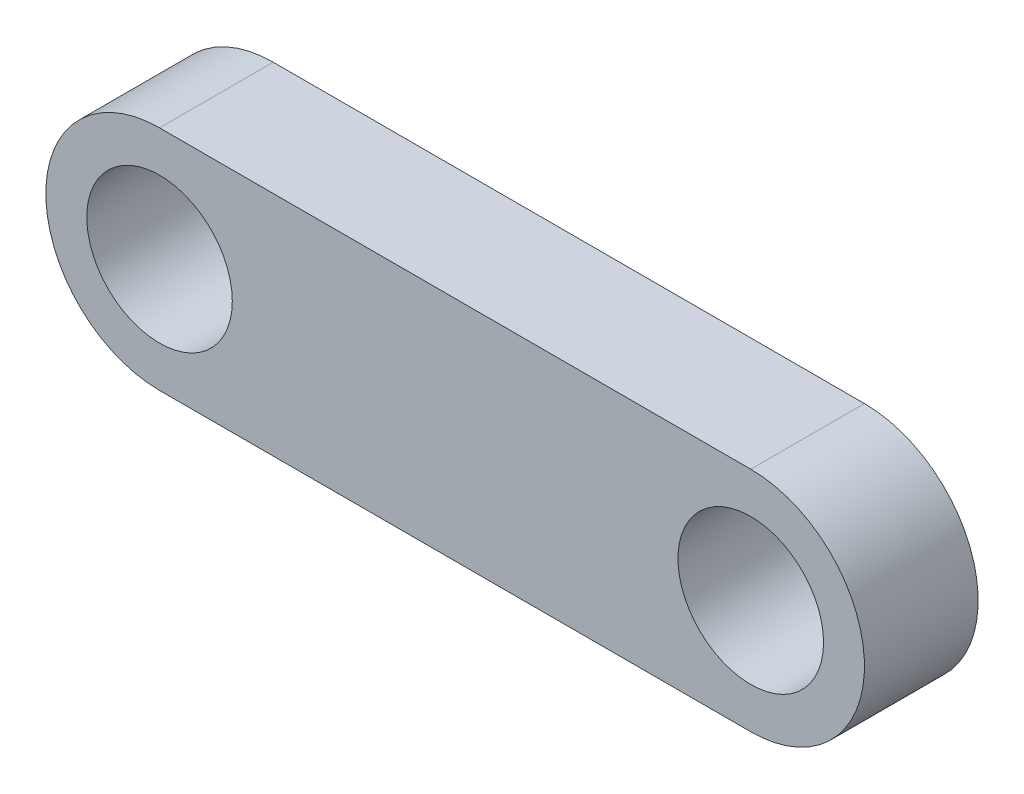
ISO-10303-21;
HEADER;
FILE_DESCRIPTION(('STEP AP214'),'2;1');
FILE_NAME('part.step','',(''),(''),'','','');
FILE_SCHEMA(('AUTOMOTIVE_DESIGN { 1 0 10303 214 1 1 1 1 }'));
ENDSEC;
DATA;
#1=APPLICATION_CONTEXT('core data for automotive mechanical design processes');
#2=APPLICATION_PROTOCOL_DEFINITION('international standard','automotive_design',2000,#1);
#3=PRODUCT_CONTEXT('',#1,'mechanical');
#4=PRODUCT('Part','Part','',(#3));
#5=PRODUCT_RELATED_PRODUCT_CATEGORY('part','',(#4));
#6=PRODUCT_DEFINITION_FORMATION('','',#4);
#7=PRODUCT_DEFINITION_CONTEXT('part definition',#1,'design');
#8=PRODUCT_DEFINITION('design','',#6,#7);
#9=PRODUCT_DEFINITION_SHAPE('','',#8);
#10=(LENGTH_UNIT() NAMED_UNIT(*) SI_UNIT(.MILLI.,.METRE.));
#11=(NAMED_UNIT(*) PLANE_ANGLE_UNIT() SI_UNIT($,.RADIAN.));
#12=(NAMED_UNIT(*) SI_UNIT($,.STERADIAN.) SOLID_ANGLE_UNIT());
#13=UNCERTAINTY_MEASURE_WITH_UNIT(LENGTH_MEASURE(1.E-05),#10,'distance_accuracy_value','');
#14=(GEOMETRIC_REPRESENTATION_CONTEXT(3) GLOBAL_UNCERTAINTY_ASSIGNED_CONTEXT((#13)) GLOBAL_UNIT_ASSIGNED_CONTEXT((#10,
#11,#12)) REPRESENTATION_CONTEXT('',''));
#15=CARTESIAN_POINT('',(0.,0.,0.));
#16=DIRECTION('',(0.,0.,1.));
#17=DIRECTION('',(1.,0.,0.));
#18=AXIS2_PLACEMENT_3D('',#15,#16,#17);
#19=CARTESIAN_POINT('',(-4.7939262472885,0.,2.5));
#20=DIRECTION('',(0.,0.,1.));
#21=DIRECTION('',(1.,0.,0.));
#22=AXIS2_PLACEMENT_3D('',#19,#20,#21);
#23=PLANE('',#22);
#24=CARTESIAN_POINT('',(-4.7939262472885,0.,2.5));
#25=DIRECTION('',(0.,0.,1.));
#26=DIRECTION('',(1.,0.,0.));
#27=AXIS2_PLACEMENT_3D('',#24,#25,#26);
#28=CIRCLE('',#27,1.6);
#29=CARTESIAN_POINT('',(-3.1939262472885,0.,2.5));
#30=VERTEX_POINT('',#29);
#31=EDGE_CURVE('E11',#30,#30,#28,.T.);
#32=ORIENTED_EDGE('',*,*,#31,.F.);
#33=EDGE_LOOP('',(#32));
#34=FACE_BOUND('',#33,.T.);
#35=CARTESIAN_POINT('',(8.2060737527115,0.,2.5));
#36=DIRECTION('',(0.,0.,1.));
#37=DIRECTION('',(1.,0.,0.));
#38=AXIS2_PLACEMENT_3D('',#35,#36,#37);
#39=CIRCLE('',#38,1.6);
#40=CARTESIAN_POINT('',(9.8060737527115,0.,2.5));
#41=VERTEX_POINT('',#40);
#42=EDGE_CURVE('E114',#41,#41,#39,.T.);
#43=ORIENTED_EDGE('',*,*,#42,.F.);
#44=EDGE_LOOP('',(#43));
#45=FACE_BOUND('',#44,.T.);
#46=CARTESIAN_POINT('',(8.2060737527115,0.,2.5));
#47=DIRECTION('',(0.,0.,-1.));
#48=DIRECTION('',(-1.,0.,0.));
#49=AXIS2_PLACEMENT_3D('',#46,#47,#48);
#50=CIRCLE('',#49,2.5);
#51=CARTESIAN_POINT('',(8.2060737527115,2.5,2.5));
#52=VERTEX_POINT('',#51);
#53=CARTESIAN_POINT('',(8.2060737527115,-2.5,2.5));
#54=VERTEX_POINT('',#53);
#55=EDGE_CURVE('E96',#52,#54,#50,.T.);
#56=ORIENTED_EDGE('',*,*,#55,.F.);
#57=DIRECTION('',(1.,0.,0.));
#58=VECTOR('',#57,1.);
#59=CARTESIAN_POINT('',(8.2060737527115,2.5,2.5));
#60=LINE('',#59,#58);
#61=CARTESIAN_POINT('',(-4.7939262472885,2.5,2.5));
#62=VERTEX_POINT('',#61);
#63=EDGE_CURVE('E93',#62,#52,#60,.T.);
#64=ORIENTED_EDGE('',*,*,#63,.F.);
#65=CARTESIAN_POINT('',(-4.7939262472885,0.,2.5));
#66=DIRECTION('',(0.,0.,-1.));
#67=DIRECTION('',(-1.,0.,0.));
#68=AXIS2_PLACEMENT_3D('',#65,#66,#67);
#69=CIRCLE('',#68,2.5);
#70=CARTESIAN_POINT('',(-4.7939262472885,-2.5,2.5));
#71=VERTEX_POINT('',#70);
#72=EDGE_CURVE('E86',#71,#62,#69,.T.);
#73=ORIENTED_EDGE('',*,*,#72,.F.);
#74=DIRECTION('',(-1.,0.,0.));
#75=VECTOR('',#74,1.);
#76=CARTESIAN_POINT('',(8.2060737527115,-2.5,2.5));
#77=LINE('',#76,#75);
#78=EDGE_CURVE('E92',#54,#71,#77,.T.);
#79=ORIENTED_EDGE('',*,*,#78,.F.);
#80=EDGE_LOOP('',(#56,#64,#73,#79));
#81=FACE_BOUND('',#80,.T.);
#82=ADVANCED_FACE('F35',(#34,#45,#81),#23,.T.);
#83=CARTESIAN_POINT('',(-4.7939262472885,0.,0.));
#84=DIRECTION('',(0.,0.,1.));
#85=DIRECTION('',(1.,0.,0.));
#86=AXIS2_PLACEMENT_3D('',#83,#84,#85);
#87=PLANE('',#86);
#88=CARTESIAN_POINT('',(-4.7939262472885,0.,0.));
#89=DIRECTION('',(0.,0.,1.));
#90=DIRECTION('',(1.,0.,0.));
#91=AXIS2_PLACEMENT_3D('',#88,#89,#90);
#92=CIRCLE('',#91,1.6);
#93=CARTESIAN_POINT('',(-3.1939262472885,0.,0.));
#94=VERTEX_POINT('',#93);
#95=EDGE_CURVE('E39',#94,#94,#92,.T.);
#96=ORIENTED_EDGE('',*,*,#95,.T.);
#97=EDGE_LOOP('',(#96));
#98=FACE_BOUND('',#97,.T.);
#99=CARTESIAN_POINT('',(8.2060737527115,0.,0.));
#100=DIRECTION('',(0.,0.,1.));
#101=DIRECTION('',(1.,0.,0.));
#102=AXIS2_PLACEMENT_3D('',#99,#100,#101);
#103=CIRCLE('',#102,1.6);
#104=CARTESIAN_POINT('',(9.8060737527115,0.,0.));
#105=VERTEX_POINT('',#104);
#106=EDGE_CURVE('E111',#105,#105,#103,.T.);
#107=ORIENTED_EDGE('',*,*,#106,.T.);
#108=EDGE_LOOP('',(#107));
#109=FACE_BOUND('',#108,.T.);
#110=CARTESIAN_POINT('',(8.2060737527115,0.,0.));
#111=DIRECTION('',(0.,0.,-1.));
#112=DIRECTION('',(-1.,0.,0.));
#113=AXIS2_PLACEMENT_3D('',#110,#111,#112);
#114=CIRCLE('',#113,2.5);
#115=CARTESIAN_POINT('',(8.2060737527115,2.5,0.));
#116=VERTEX_POINT('',#115);
#117=CARTESIAN_POINT('',(8.2060737527115,-2.5,0.));
#118=VERTEX_POINT('',#117);
#119=EDGE_CURVE('E102',#116,#118,#114,.T.);
#120=ORIENTED_EDGE('',*,*,#119,.T.);
#121=DIRECTION('',(-1.,0.,0.));
#122=VECTOR('',#121,1.);
#123=CARTESIAN_POINT('',(8.2060737527115,-2.5,0.));
#124=LINE('',#123,#122);
#125=CARTESIAN_POINT('',(-4.7939262472885,-2.5,0.));
#126=VERTEX_POINT('',#125);
#127=EDGE_CURVE('E105',#118,#126,#124,.T.);
#128=ORIENTED_EDGE('',*,*,#127,.T.);
#129=CARTESIAN_POINT('',(-4.7939262472885,0.,0.));
#130=DIRECTION('',(0.,0.,-1.));
#131=DIRECTION('',(-1.,0.,0.));
#132=AXIS2_PLACEMENT_3D('',#129,#130,#131);
#133=CIRCLE('',#132,2.5);
#134=CARTESIAN_POINT('',(-4.7939262472885,2.5,0.));
#135=VERTEX_POINT('',#134);
#136=EDGE_CURVE('E88',#126,#135,#133,.T.);
#137=ORIENTED_EDGE('',*,*,#136,.T.);
#138=DIRECTION('',(1.,0.,0.));
#139=VECTOR('',#138,1.);
#140=CARTESIAN_POINT('',(8.2060737527115,2.5,0.));
#141=LINE('',#140,#139);
#142=EDGE_CURVE('E98',#135,#116,#141,.T.);
#143=ORIENTED_EDGE('',*,*,#142,.T.);
#144=EDGE_LOOP('',(#120,#128,#137,#143));
#145=FACE_BOUND('',#144,.T.);
#146=ADVANCED_FACE('F37',(#98,#109,#145),#87,.F.);
#147=CARTESIAN_POINT('',(-4.7939262472885,0.,2.5));
#148=DIRECTION('',(0.,0.,-1.));
#149=DIRECTION('',(-1.,0.,0.));
#150=AXIS2_PLACEMENT_3D('',#147,#148,#149);
#151=CYLINDRICAL_SURFACE('',#150,1.6);
#152=ORIENTED_EDGE('',*,*,#31,.T.);
#153=EDGE_LOOP('',(#152));
#154=FACE_BOUND('',#153,.T.);
#155=ORIENTED_EDGE('',*,*,#95,.F.);
#156=EDGE_LOOP('',(#155));
#157=FACE_BOUND('',#156,.T.);
#158=ADVANCED_FACE('F125',(#154,#157),#151,.F.);
#159=CARTESIAN_POINT('',(8.2060737527115,0.,2.5));
#160=DIRECTION('',(0.,0.,-1.));
#161=DIRECTION('',(-1.,0.,0.));
#162=AXIS2_PLACEMENT_3D('',#159,#160,#161);
#163=CYLINDRICAL_SURFACE('',#162,1.6);
#164=ORIENTED_EDGE('',*,*,#42,.T.);
#165=EDGE_LOOP('',(#164));
#166=FACE_BOUND('',#165,.T.);
#167=ORIENTED_EDGE('',*,*,#106,.F.);
#168=EDGE_LOOP('',(#167));
#169=FACE_BOUND('',#168,.T.);
#170=ADVANCED_FACE('F122',(#166,#169),#163,.F.);
#171=CARTESIAN_POINT('',(8.2060737527115,0.,2.5));
#172=DIRECTION('',(0.,0.,-1.));
#173=DIRECTION('',(-1.,0.,0.));
#174=AXIS2_PLACEMENT_3D('',#171,#172,#173);
#175=CYLINDRICAL_SURFACE('',#174,2.5);
#176=ORIENTED_EDGE('',*,*,#119,.F.);
#177=DIRECTION('',(0.,0.,-1.));
#178=VECTOR('',#177,1.);
#179=CARTESIAN_POINT('',(8.2060737527115,2.5,2.5));
#180=LINE('',#179,#178);
#181=EDGE_CURVE('E52',#52,#116,#180,.T.);
#182=ORIENTED_EDGE('',*,*,#181,.F.);
#183=ORIENTED_EDGE('',*,*,#55,.T.);
#184=DIRECTION('',(0.,0.,-1.));
#185=VECTOR('',#184,1.);
#186=CARTESIAN_POINT('',(8.2060737527115,-2.5,2.5));
#187=LINE('',#186,#185);
#188=EDGE_CURVE('E80',#54,#118,#187,.T.);
#189=ORIENTED_EDGE('',*,*,#188,.T.);
#190=EDGE_LOOP('',(#176,#182,#183,#189));
#191=FACE_BOUND('',#190,.T.);
#192=ADVANCED_FACE('F124',(#191),#175,.T.);
#193=CARTESIAN_POINT('',(8.2060737527115,2.5,2.5));
#194=DIRECTION('',(0.,1.,0.));
#195=DIRECTION('',(0.,0.,1.));
#196=AXIS2_PLACEMENT_3D('',#193,#194,#195);
#197=PLANE('',#196);
#198=ORIENTED_EDGE('',*,*,#142,.F.);
#199=DIRECTION('',(0.,0.,-1.));
#200=VECTOR('',#199,1.);
#201=CARTESIAN_POINT('',(-4.7939262472885,2.5,2.5));
#202=LINE('',#201,#200);
#203=EDGE_CURVE('E69',#62,#135,#202,.T.);
#204=ORIENTED_EDGE('',*,*,#203,.F.);
#205=ORIENTED_EDGE('',*,*,#63,.T.);
#206=ORIENTED_EDGE('',*,*,#181,.T.);
#207=EDGE_LOOP('',(#198,#204,#205,#206));
#208=FACE_BOUND('',#207,.T.);
#209=ADVANCED_FACE('F132',(#208),#197,.T.);
#210=CARTESIAN_POINT('',(-4.7939262472885,0.,2.5));
#211=DIRECTION('',(0.,0.,-1.));
#212=DIRECTION('',(-1.,0.,0.));
#213=AXIS2_PLACEMENT_3D('',#210,#211,#212);
#214=CYLINDRICAL_SURFACE('',#213,2.5);
#215=ORIENTED_EDGE('',*,*,#136,.F.);
#216=DIRECTION('',(0.,0.,-1.));
#217=VECTOR('',#216,1.);
#218=CARTESIAN_POINT('',(-4.7939262472885,-2.5,2.5));
#219=LINE('',#218,#217);
#220=EDGE_CURVE('E83',#71,#126,#219,.T.);
#221=ORIENTED_EDGE('',*,*,#220,.F.);
#222=ORIENTED_EDGE('',*,*,#72,.T.);
#223=ORIENTED_EDGE('',*,*,#203,.T.);
#224=EDGE_LOOP('',(#215,#221,#222,#223));
#225=FACE_BOUND('',#224,.T.);
#226=ADVANCED_FACE('F85',(#225),#214,.T.);
#227=CARTESIAN_POINT('',(8.2060737527115,-2.5,2.5));
#228=DIRECTION('',(0.,-1.,0.));
#229=DIRECTION('',(0.,0.,-1.));
#230=AXIS2_PLACEMENT_3D('',#227,#228,#229);
#231=PLANE('',#230);
#232=ORIENTED_EDGE('',*,*,#127,.F.);
#233=ORIENTED_EDGE('',*,*,#188,.F.);
#234=ORIENTED_EDGE('',*,*,#78,.T.);
#235=ORIENTED_EDGE('',*,*,#220,.T.);
#236=EDGE_LOOP('',(#232,#233,#234,#235));
#237=FACE_BOUND('',#236,.T.);
#238=ADVANCED_FACE('F95',(#237),#231,.T.);
#239=CLOSED_SHELL('',(#82,#146,#158,#170,#192,#209,#226,#238));
#240=MANIFOLD_SOLID_BREP('B2',#239);
#241=ADVANCED_BREP_SHAPE_REPRESENTATION('',(#18,#240),#14);
#242=SHAPE_DEFINITION_REPRESENTATION(#9,#241);
ENDSEC;
END-ISO-10303-21;
